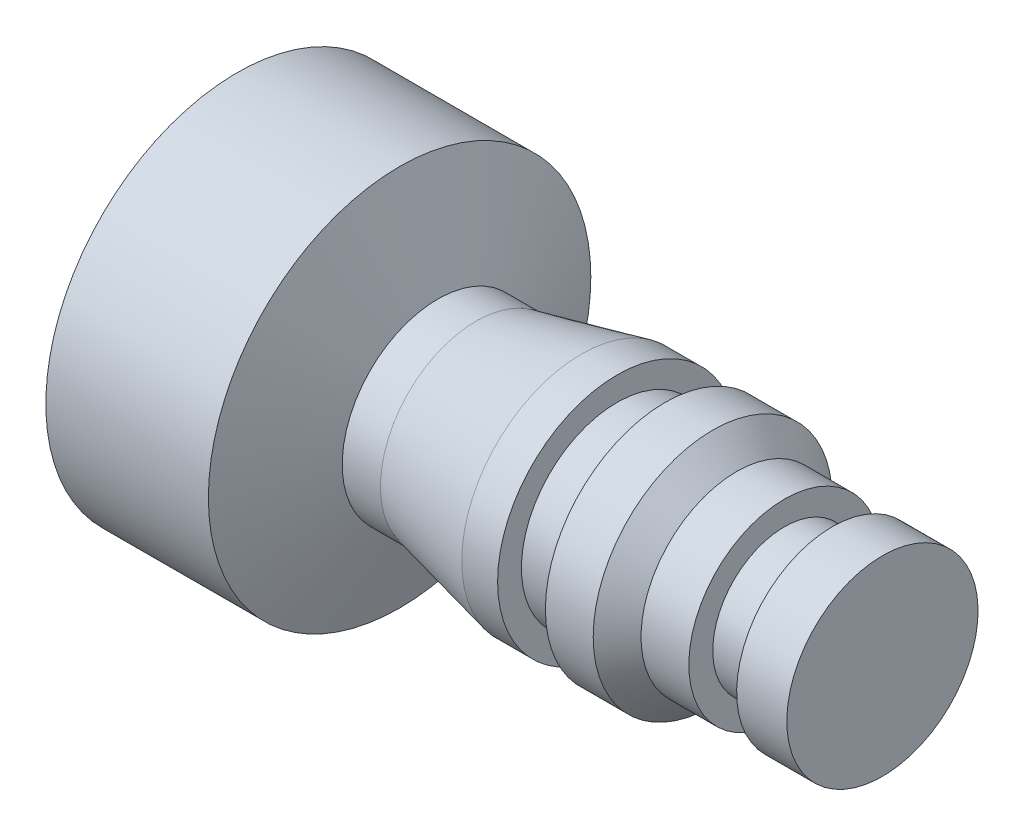
ISO-10303-21;
HEADER;
FILE_DESCRIPTION(('STEP AP214'),'2;1');
FILE_NAME('part.step','',(''),(''),'','','');
FILE_SCHEMA(('AUTOMOTIVE_DESIGN { 1 0 10303 214 1 1 1 1 }'));
ENDSEC;
DATA;
#1=APPLICATION_CONTEXT('core data for automotive mechanical design processes');
#2=APPLICATION_PROTOCOL_DEFINITION('international standard','automotive_design',2000,#1);
#3=PRODUCT_CONTEXT('',#1,'mechanical');
#4=PRODUCT('Part','Part','',(#3));
#5=PRODUCT_RELATED_PRODUCT_CATEGORY('part','',(#4));
#6=PRODUCT_DEFINITION_FORMATION('','',#4);
#7=PRODUCT_DEFINITION_CONTEXT('part definition',#1,'design');
#8=PRODUCT_DEFINITION('design','',#6,#7);
#9=PRODUCT_DEFINITION_SHAPE('','',#8);
#10=(LENGTH_UNIT() NAMED_UNIT(*) SI_UNIT(.MILLI.,.METRE.));
#11=(NAMED_UNIT(*) PLANE_ANGLE_UNIT() SI_UNIT($,.RADIAN.));
#12=(NAMED_UNIT(*) SI_UNIT($,.STERADIAN.) SOLID_ANGLE_UNIT());
#13=UNCERTAINTY_MEASURE_WITH_UNIT(LENGTH_MEASURE(1.E-05),#10,'distance_accuracy_value','');
#14=(GEOMETRIC_REPRESENTATION_CONTEXT(3) GLOBAL_UNCERTAINTY_ASSIGNED_CONTEXT((#13)) GLOBAL_UNIT_ASSIGNED_CONTEXT((#10,
#11,#12)) REPRESENTATION_CONTEXT('',''));
#15=CARTESIAN_POINT('',(0.,0.,0.));
#16=DIRECTION('',(0.,0.,1.));
#17=DIRECTION('',(1.,0.,0.));
#18=AXIS2_PLACEMENT_3D('',#15,#16,#17);
#19=CARTESIAN_POINT('',(-171.45,-51.8068908234,-51.411436801));
#20=DIRECTION('',(-1.,0.,0.));
#21=DIRECTION('',(0.,0.,1.));
#22=AXIS2_PLACEMENT_3D('',#19,#20,#21);
#23=PLANE('',#22);
#24=CARTESIAN_POINT('',(-171.45,0.,0.));
#25=DIRECTION('',(1.,0.,0.));
#26=DIRECTION('',(0.,0.,-1.));
#27=AXIS2_PLACEMENT_3D('',#24,#25,#26);
#28=CIRCLE('',#27,50.8);
#29=CARTESIAN_POINT('',(-171.45,0.,-50.8));
#30=VERTEX_POINT('',#29);
#31=EDGE_CURVE('E16',#30,#30,#28,.T.);
#32=ORIENTED_EDGE('',*,*,#31,.F.);
#33=EDGE_LOOP('',(#32));
#34=FACE_BOUND('',#33,.T.);
#35=ADVANCED_FACE('F12',(#34),#23,.T.);
#36=CARTESIAN_POINT('',(-171.45,0.,0.));
#37=DIRECTION('',(1.,0.,0.));
#38=DIRECTION('',(0.,0.,-1.));
#39=AXIS2_PLACEMENT_3D('',#36,#37,#38);
#40=CYLINDRICAL_SURFACE('',#39,50.8);
#41=CARTESIAN_POINT('',(-128.27,0.,0.));
#42=DIRECTION('',(-1.,0.,0.));
#43=DIRECTION('',(0.,0.,1.));
#44=AXIS2_PLACEMENT_3D('',#41,#42,#43);
#45=CIRCLE('',#44,50.8);
#46=CARTESIAN_POINT('',(-128.27,0.,50.8));
#47=VERTEX_POINT('',#46);
#48=EDGE_CURVE('E28',#47,#47,#45,.F.);
#49=ORIENTED_EDGE('',*,*,#48,.F.);
#50=EDGE_LOOP('',(#49));
#51=FACE_BOUND('',#50,.T.);
#52=ORIENTED_EDGE('',*,*,#31,.T.);
#53=EDGE_LOOP('',(#52));
#54=FACE_BOUND('',#53,.T.);
#55=ADVANCED_FACE('F73',(#51,#54),#40,.T.);
#56=CARTESIAN_POINT('',(-118.11,0.,0.));
#57=DIRECTION('',(-1.,0.,0.));
#58=DIRECTION('',(0.,0.,1.));
#59=AXIS2_PLACEMENT_3D('',#56,#57,#58);
#60=CONICAL_SURFACE('',#59,25.4,1.19028994968253);
#61=ORIENTED_EDGE('',*,*,#48,.T.);
#62=EDGE_LOOP('',(#61));
#63=FACE_BOUND('',#62,.T.);
#64=CARTESIAN_POINT('',(-118.11,0.,0.));
#65=DIRECTION('',(1.,0.,0.));
#66=DIRECTION('',(0.,0.,-1.));
#67=AXIS2_PLACEMENT_3D('',#64,#65,#66);
#68=CIRCLE('',#67,25.4);
#69=CARTESIAN_POINT('',(-118.11,0.,-25.4));
#70=VERTEX_POINT('',#69);
#71=EDGE_CURVE('E60',#70,#70,#68,.T.);
#72=ORIENTED_EDGE('',*,*,#71,.F.);
#73=EDGE_LOOP('',(#72));
#74=FACE_BOUND('',#73,.T.);
#75=ADVANCED_FACE('F81',(#63,#74),#60,.T.);
#76=CARTESIAN_POINT('',(-118.11,0.,0.));
#77=DIRECTION('',(1.,0.,0.));
#78=DIRECTION('',(0.,0.,-1.));
#79=AXIS2_PLACEMENT_3D('',#76,#77,#78);
#80=CYLINDRICAL_SURFACE('',#79,25.4);
#81=CARTESIAN_POINT('',(-107.95,0.,0.));
#82=DIRECTION('',(1.,0.,0.));
#83=DIRECTION('',(0.,0.,-1.));
#84=AXIS2_PLACEMENT_3D('',#81,#82,#83);
#85=CIRCLE('',#84,25.4);
#86=CARTESIAN_POINT('',(-107.95,0.,-25.4));
#87=VERTEX_POINT('',#86);
#88=EDGE_CURVE('E55',#87,#87,#85,.T.);
#89=ORIENTED_EDGE('',*,*,#88,.F.);
#90=EDGE_LOOP('',(#89));
#91=FACE_BOUND('',#90,.T.);
#92=ORIENTED_EDGE('',*,*,#71,.T.);
#93=EDGE_LOOP('',(#92));
#94=FACE_BOUND('',#93,.T.);
#95=ADVANCED_FACE('F124',(#91,#94),#80,.T.);
#96=CARTESIAN_POINT('',(-107.95,0.,0.));
#97=DIRECTION('',(1.,0.,0.));
#98=DIRECTION('',(0.,1.,0.));
#99=AXIS2_PLACEMENT_3D('',#96,#97,#98);
#100=CONICAL_SURFACE('',#99,25.4,0.223476601140633);
#101=CARTESIAN_POINT('',(-80.01,0.,0.));
#102=DIRECTION('',(1.,0.,0.));
#103=DIRECTION('',(0.,0.,-1.));
#104=AXIS2_PLACEMENT_3D('',#101,#102,#103);
#105=CIRCLE('',#104,31.75);
#106=CARTESIAN_POINT('',(-80.01,0.,-31.75));
#107=VERTEX_POINT('',#106);
#108=EDGE_CURVE('E51',#107,#107,#105,.T.);
#109=ORIENTED_EDGE('',*,*,#108,.F.);
#110=EDGE_LOOP('',(#109));
#111=FACE_BOUND('',#110,.T.);
#112=ORIENTED_EDGE('',*,*,#88,.T.);
#113=EDGE_LOOP('',(#112));
#114=FACE_BOUND('',#113,.T.);
#115=ADVANCED_FACE('F121',(#111,#114),#100,.T.);
#116=CARTESIAN_POINT('',(-80.01,0.,0.));
#117=DIRECTION('',(1.,0.,0.));
#118=DIRECTION('',(0.,0.,-1.));
#119=AXIS2_PLACEMENT_3D('',#116,#117,#118);
#120=CYLINDRICAL_SURFACE('',#119,31.75);
#121=CARTESIAN_POINT('',(-70.485,0.,0.));
#122=DIRECTION('',(1.,0.,0.));
#123=DIRECTION('',(0.,0.,-1.));
#124=AXIS2_PLACEMENT_3D('',#121,#122,#123);
#125=CIRCLE('',#124,31.75);
#126=CARTESIAN_POINT('',(-70.485,0.,-31.75));
#127=VERTEX_POINT('',#126);
#128=EDGE_CURVE('E49',#127,#127,#125,.F.);
#129=ORIENTED_EDGE('',*,*,#128,.T.);
#130=EDGE_LOOP('',(#129));
#131=FACE_BOUND('',#130,.T.);
#132=ORIENTED_EDGE('',*,*,#108,.T.);
#133=EDGE_LOOP('',(#132));
#134=FACE_BOUND('',#133,.T.);
#135=ADVANCED_FACE('F118',(#131,#134),#120,.T.);
#136=CARTESIAN_POINT('',(-70.485,-32.3793067678,-32.1321480038));
#137=DIRECTION('',(-1.,0.,0.));
#138=DIRECTION('',(0.,0.,1.));
#139=AXIS2_PLACEMENT_3D('',#136,#137,#138);
#140=PLANE('',#139);
#141=CARTESIAN_POINT('',(-70.485,0.,0.));
#142=DIRECTION('',(1.,0.,0.));
#143=DIRECTION('',(0.,0.,-1.));
#144=AXIS2_PLACEMENT_3D('',#141,#142,#143);
#145=CIRCLE('',#144,25.4274756372);
#146=CARTESIAN_POINT('',(-70.485,0.,-25.4274756372));
#147=VERTEX_POINT('',#146);
#148=EDGE_CURVE('E47',#147,#147,#145,.T.);
#149=ORIENTED_EDGE('',*,*,#148,.F.);
#150=EDGE_LOOP('',(#149));
#151=FACE_BOUND('',#150,.T.);
#152=ORIENTED_EDGE('',*,*,#128,.F.);
#153=EDGE_LOOP('',(#152));
#154=FACE_BOUND('',#153,.T.);
#155=ADVANCED_FACE('F116',(#151,#154),#140,.F.);
#156=CARTESIAN_POINT('',(-70.485,0.,0.));
#157=DIRECTION('',(1.,0.,0.));
#158=DIRECTION('',(0.,0.,-1.));
#159=AXIS2_PLACEMENT_3D('',#156,#157,#158);
#160=CYLINDRICAL_SURFACE('',#159,25.4274756372);
#161=CARTESIAN_POINT('',(-57.785,0.,0.));
#162=DIRECTION('',(1.,0.,0.));
#163=DIRECTION('',(0.,0.,-1.));
#164=AXIS2_PLACEMENT_3D('',#161,#162,#163);
#165=CIRCLE('',#164,25.4274756372);
#166=CARTESIAN_POINT('',(-57.785,0.,-25.4274756372));
#167=VERTEX_POINT('',#166);
#168=EDGE_CURVE('E44',#167,#167,#165,.F.);
#169=ORIENTED_EDGE('',*,*,#168,.T.);
#170=EDGE_LOOP('',(#169));
#171=FACE_BOUND('',#170,.T.);
#172=ORIENTED_EDGE('',*,*,#148,.T.);
#173=EDGE_LOOP('',(#172));
#174=FACE_BOUND('',#173,.T.);
#175=ADVANCED_FACE('F113',(#171,#174),#160,.T.);
#176=CARTESIAN_POINT('',(-57.785,-32.3793067678,32.323480184));
#177=DIRECTION('',(1.,0.,0.));
#178=DIRECTION('',(0.,0.,-1.));
#179=AXIS2_PLACEMENT_3D('',#176,#177,#178);
#180=PLANE('',#179);
#181=ORIENTED_EDGE('',*,*,#168,.F.);
#182=EDGE_LOOP('',(#181));
#183=FACE_BOUND('',#182,.T.);
#184=CARTESIAN_POINT('',(-57.785,0.,0.));
#185=DIRECTION('',(1.,0.,0.));
#186=DIRECTION('',(0.,0.,-1.));
#187=AXIS2_PLACEMENT_3D('',#184,#185,#186);
#188=CIRCLE('',#187,31.75);
#189=CARTESIAN_POINT('',(-57.785,0.,-31.75));
#190=VERTEX_POINT('',#189);
#191=EDGE_CURVE('E40',#190,#190,#188,.T.);
#192=ORIENTED_EDGE('',*,*,#191,.F.);
#193=EDGE_LOOP('',(#192));
#194=FACE_BOUND('',#193,.T.);
#195=ADVANCED_FACE('F111',(#183,#194),#180,.F.);
#196=CARTESIAN_POINT('',(-57.785,0.,0.));
#197=DIRECTION('',(1.,0.,0.));
#198=DIRECTION('',(0.,0.,-1.));
#199=AXIS2_PLACEMENT_3D('',#196,#197,#198);
#200=CYLINDRICAL_SURFACE('',#199,31.75);
#201=CARTESIAN_POINT('',(-45.0849999999999,0.,0.));
#202=DIRECTION('',(-1.,0.,0.));
#203=DIRECTION('',(0.,0.,1.));
#204=AXIS2_PLACEMENT_3D('',#201,#202,#203);
#205=CIRCLE('',#204,31.75);
#206=CARTESIAN_POINT('',(-45.085,0.,31.75));
#207=VERTEX_POINT('',#206);
#208=EDGE_CURVE('E43',#207,#207,#205,.F.);
#209=ORIENTED_EDGE('',*,*,#208,.F.);
#210=EDGE_LOOP('',(#209));
#211=FACE_BOUND('',#210,.T.);
#212=ORIENTED_EDGE('',*,*,#191,.T.);
#213=EDGE_LOOP('',(#212));
#214=FACE_BOUND('',#213,.T.);
#215=ADVANCED_FACE('F107',(#211,#214),#200,.T.);
#216=CARTESIAN_POINT('',(-38.735,0.,0.));
#217=DIRECTION('',(-1.,0.,0.));
#218=DIRECTION('',(0.,-1.,0.));
#219=AXIS2_PLACEMENT_3D('',#216,#217,#218);
#220=CONICAL_SURFACE('',#219,25.4,0.785398163397447);
#221=ORIENTED_EDGE('',*,*,#208,.T.);
#222=EDGE_LOOP('',(#221));
#223=FACE_BOUND('',#222,.T.);
#224=CARTESIAN_POINT('',(-38.735,0.,0.));
#225=DIRECTION('',(1.,0.,0.));
#226=DIRECTION('',(0.,0.,-1.));
#227=AXIS2_PLACEMENT_3D('',#224,#225,#226);
#228=CIRCLE('',#227,25.4);
#229=CARTESIAN_POINT('',(-38.735,0.,-25.4));
#230=VERTEX_POINT('',#229);
#231=EDGE_CURVE('E39',#230,#230,#228,.T.);
#232=ORIENTED_EDGE('',*,*,#231,.F.);
#233=EDGE_LOOP('',(#232));
#234=FACE_BOUND('',#233,.T.);
#235=ADVANCED_FACE('F103',(#223,#234),#220,.T.);
#236=CARTESIAN_POINT('',(-38.735,0.,0.));
#237=DIRECTION('',(1.,0.,0.));
#238=DIRECTION('',(0.,1.,0.));
#239=AXIS2_PLACEMENT_3D('',#236,#237,#238);
#240=CYLINDRICAL_SURFACE('',#239,25.4);
#241=CARTESIAN_POINT('',(-26.035,0.,0.));
#242=DIRECTION('',(1.,0.,0.));
#243=DIRECTION('',(0.,1.,0.));
#244=AXIS2_PLACEMENT_3D('',#241,#242,#243);
#245=CIRCLE('',#244,25.4);
#246=CARTESIAN_POINT('',(-26.035,25.4,0.));
#247=VERTEX_POINT('',#246);
#248=EDGE_CURVE('E36',#247,#247,#245,.F.);
#249=ORIENTED_EDGE('',*,*,#248,.T.);
#250=EDGE_LOOP('',(#249));
#251=FACE_BOUND('',#250,.T.);
#252=ORIENTED_EDGE('',*,*,#231,.T.);
#253=EDGE_LOOP('',(#252));
#254=FACE_BOUND('',#253,.T.);
#255=ADVANCED_FACE('F100',(#251,#254),#240,.T.);
#256=CARTESIAN_POINT('',(-26.035,-25.903445399,-25.7057183878));
#257=DIRECTION('',(-1.,0.,0.));
#258=DIRECTION('',(0.,0.,1.));
#259=AXIS2_PLACEMENT_3D('',#256,#257,#258);
#260=PLANE('',#259);
#261=CARTESIAN_POINT('',(-26.035,0.,0.));
#262=DIRECTION('',(1.,0.,0.));
#263=DIRECTION('',(0.,0.,-1.));
#264=AXIS2_PLACEMENT_3D('',#261,#262,#263);
#265=CIRCLE('',#264,19.0415817542);
#266=CARTESIAN_POINT('',(-26.035,0.,-19.0415817542));
#267=VERTEX_POINT('',#266);
#268=EDGE_CURVE('E33',#267,#267,#265,.T.);
#269=ORIENTED_EDGE('',*,*,#268,.F.);
#270=EDGE_LOOP('',(#269));
#271=FACE_BOUND('',#270,.T.);
#272=ORIENTED_EDGE('',*,*,#248,.F.);
#273=EDGE_LOOP('',(#272));
#274=FACE_BOUND('',#273,.T.);
#275=ADVANCED_FACE('F98',(#271,#274),#260,.F.);
#276=CARTESIAN_POINT('',(-26.035,0.,0.));
#277=DIRECTION('',(1.,0.,0.));
#278=DIRECTION('',(0.,0.,-1.));
#279=AXIS2_PLACEMENT_3D('',#276,#277,#278);
#280=CYLINDRICAL_SURFACE('',#279,19.0415817542);
#281=CARTESIAN_POINT('',(-13.335,0.,0.));
#282=DIRECTION('',(1.,0.,0.));
#283=DIRECTION('',(0.,0.,-1.));
#284=AXIS2_PLACEMENT_3D('',#281,#282,#283);
#285=CIRCLE('',#284,19.0415817542);
#286=CARTESIAN_POINT('',(-13.335,0.,-19.0415817542));
#287=VERTEX_POINT('',#286);
#288=EDGE_CURVE('E25',#287,#287,#285,.F.);
#289=ORIENTED_EDGE('',*,*,#288,.T.);
#290=EDGE_LOOP('',(#289));
#291=FACE_BOUND('',#290,.T.);
#292=ORIENTED_EDGE('',*,*,#268,.T.);
#293=EDGE_LOOP('',(#292));
#294=FACE_BOUND('',#293,.T.);
#295=ADVANCED_FACE('F95',(#291,#294),#280,.T.);
#296=CARTESIAN_POINT('',(-13.335,-25.903445399,25.8587841472));
#297=DIRECTION('',(1.,0.,0.));
#298=DIRECTION('',(0.,0.,-1.));
#299=AXIS2_PLACEMENT_3D('',#296,#297,#298);
#300=PLANE('',#299);
#301=ORIENTED_EDGE('',*,*,#288,.F.);
#302=EDGE_LOOP('',(#301));
#303=FACE_BOUND('',#302,.T.);
#304=CARTESIAN_POINT('',(-13.335,0.,0.));
#305=DIRECTION('',(1.,0.,0.));
#306=DIRECTION('',(0.,1.,0.));
#307=AXIS2_PLACEMENT_3D('',#304,#305,#306);
#308=CIRCLE('',#307,25.4);
#309=CARTESIAN_POINT('',(-13.335,25.4,0.));
#310=VERTEX_POINT('',#309);
#311=EDGE_CURVE('E20',#310,#310,#308,.T.);
#312=ORIENTED_EDGE('',*,*,#311,.F.);
#313=EDGE_LOOP('',(#312));
#314=FACE_BOUND('',#313,.T.);
#315=ADVANCED_FACE('F91',(#303,#314),#300,.F.);
#316=CARTESIAN_POINT('',(0.,-25.903445399,25.8587841472));
#317=DIRECTION('',(1.,0.,0.));
#318=DIRECTION('',(0.,0.,-1.));
#319=AXIS2_PLACEMENT_3D('',#316,#317,#318);
#320=PLANE('',#319);
#321=CARTESIAN_POINT('',(0.,0.,0.));
#322=DIRECTION('',(1.,0.,0.));
#323=DIRECTION('',(0.,1.,0.));
#324=AXIS2_PLACEMENT_3D('',#321,#322,#323);
#325=CIRCLE('',#324,25.4);
#326=CARTESIAN_POINT('',(0.,25.4,0.));
#327=VERTEX_POINT('',#326);
#328=EDGE_CURVE('E8',#327,#327,#325,.F.);
#329=ORIENTED_EDGE('',*,*,#328,.F.);
#330=EDGE_LOOP('',(#329));
#331=FACE_BOUND('',#330,.T.);
#332=ADVANCED_FACE('F14',(#331),#320,.T.);
#333=CARTESIAN_POINT('',(-13.335,0.,0.));
#334=DIRECTION('',(1.,0.,0.));
#335=DIRECTION('',(0.,1.,0.));
#336=AXIS2_PLACEMENT_3D('',#333,#334,#335);
#337=CYLINDRICAL_SURFACE('',#336,25.4);
#338=ORIENTED_EDGE('',*,*,#328,.T.);
#339=EDGE_LOOP('',(#338));
#340=FACE_BOUND('',#339,.T.);
#341=ORIENTED_EDGE('',*,*,#311,.T.);
#342=EDGE_LOOP('',(#341));
#343=FACE_BOUND('',#342,.T.);
#344=ADVANCED_FACE('F86',(#340,#343),#337,.T.);
#345=CLOSED_SHELL('',(#35,#55,#75,#95,#115,#135,#155,#175,#195,#215,#235,#255,#275,#295,#315,
#332,#344));
#346=MANIFOLD_SOLID_BREP('B1',#345);
#347=ADVANCED_BREP_SHAPE_REPRESENTATION('',(#18,#346),#14);
#348=SHAPE_DEFINITION_REPRESENTATION(#9,#347);
ENDSEC;
END-ISO-10303-21;
